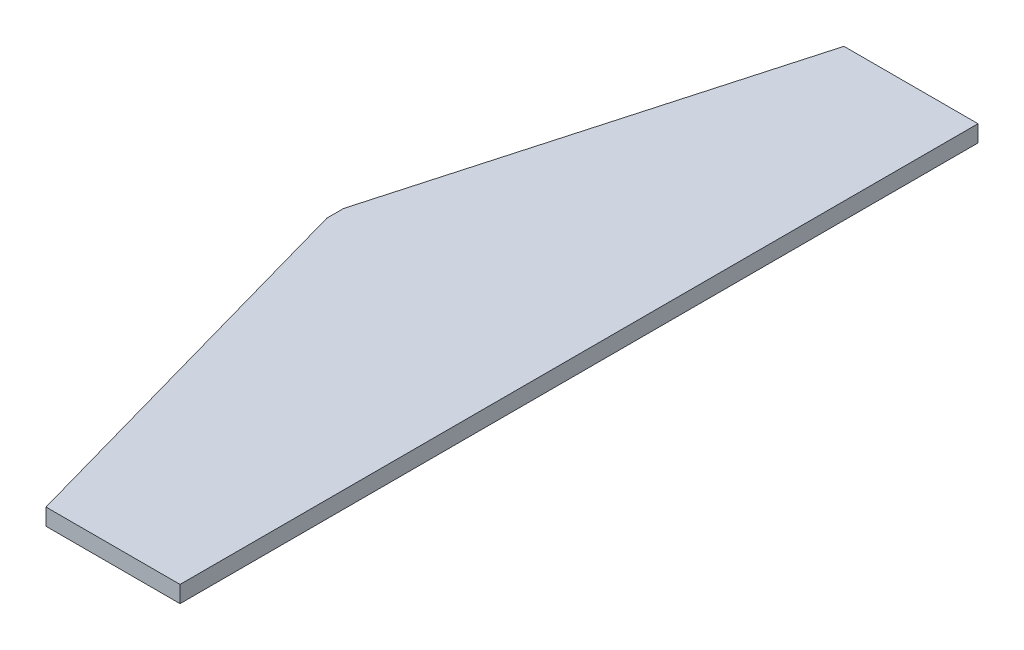
ISO-10303-21;
HEADER;
FILE_DESCRIPTION(('STEP AP214'),'2;1');
FILE_NAME('part.step','',(''),(''),'','','');
FILE_SCHEMA(('AUTOMOTIVE_DESIGN { 1 0 10303 214 1 1 1 1 }'));
ENDSEC;
DATA;
#1=APPLICATION_CONTEXT('core data for automotive mechanical design processes');
#2=APPLICATION_PROTOCOL_DEFINITION('international standard','automotive_design',2000,#1);
#3=PRODUCT_CONTEXT('',#1,'mechanical');
#4=PRODUCT('Part','Part','',(#3));
#5=PRODUCT_RELATED_PRODUCT_CATEGORY('part','',(#4));
#6=PRODUCT_DEFINITION_FORMATION('','',#4);
#7=PRODUCT_DEFINITION_CONTEXT('part definition',#1,'design');
#8=PRODUCT_DEFINITION('design','',#6,#7);
#9=PRODUCT_DEFINITION_SHAPE('','',#8);
#10=(LENGTH_UNIT() NAMED_UNIT(*) SI_UNIT(.MILLI.,.METRE.));
#11=(NAMED_UNIT(*) PLANE_ANGLE_UNIT() SI_UNIT($,.RADIAN.));
#12=(NAMED_UNIT(*) SI_UNIT($,.STERADIAN.) SOLID_ANGLE_UNIT());
#13=UNCERTAINTY_MEASURE_WITH_UNIT(LENGTH_MEASURE(1.E-05),#10,'distance_accuracy_value','');
#14=(GEOMETRIC_REPRESENTATION_CONTEXT(3) GLOBAL_UNCERTAINTY_ASSIGNED_CONTEXT((#13)) GLOBAL_UNIT_ASSIGNED_CONTEXT((#10,
#11,#12)) REPRESENTATION_CONTEXT('',''));
#15=CARTESIAN_POINT('',(0.,0.,0.));
#16=DIRECTION('',(0.,0.,1.));
#17=DIRECTION('',(1.,0.,0.));
#18=AXIS2_PLACEMENT_3D('',#15,#16,#17);
#19=CARTESIAN_POINT('',(52.4661441714905,12.,3.00000000000001));
#20=DIRECTION('',(1.,0.,0.));
#21=DIRECTION('',(0.,0.,-1.));
#22=AXIS2_PLACEMENT_3D('',#19,#20,#21);
#23=PLANE('',#22);
#24=DIRECTION('',(0.,0.,1.));
#25=VECTOR('',#24,1.);
#26=CARTESIAN_POINT('',(52.4661441714905,3.,3.00000000000001));
#27=LINE('',#26,#25);
#28=CARTESIAN_POINT('',(52.4661441714905,3.,3.00000000000001));
#29=VERTEX_POINT('',#28);
#30=CARTESIAN_POINT('',(52.4661441714905,3.,12.));
#31=VERTEX_POINT('',#30);
#32=EDGE_CURVE('E120',#29,#31,#27,.T.);
#33=ORIENTED_EDGE('',*,*,#32,.T.);
#34=DIRECTION('',(0.,-1.,0.));
#35=VECTOR('',#34,1.);
#36=CARTESIAN_POINT('',(52.4661441714905,12.,12.));
#37=LINE('',#36,#35);
#38=CARTESIAN_POINT('',(52.4661441714905,12.,12.));
#39=VERTEX_POINT('',#38);
#40=EDGE_CURVE('E11',#39,#31,#37,.T.);
#41=ORIENTED_EDGE('',*,*,#40,.F.);
#42=DIRECTION('',(0.,0.,1.));
#43=VECTOR('',#42,1.);
#44=CARTESIAN_POINT('',(52.4661441714905,12.,3.00000000000001));
#45=LINE('',#44,#43);
#46=CARTESIAN_POINT('',(52.4661441714905,12.,3.00000000000001));
#47=VERTEX_POINT('',#46);
#48=EDGE_CURVE('E131',#47,#39,#45,.T.);
#49=ORIENTED_EDGE('',*,*,#48,.F.);
#50=DIRECTION('',(0.,-1.,0.));
#51=VECTOR('',#50,1.);
#52=CARTESIAN_POINT('',(52.4661441714905,12.,3.00000000000001));
#53=LINE('',#52,#51);
#54=EDGE_CURVE('E116',#47,#29,#53,.T.);
#55=ORIENTED_EDGE('',*,*,#54,.T.);
#56=EDGE_LOOP('',(#33,#41,#49,#55));
#57=FACE_BOUND('',#56,.T.);
#58=ADVANCED_FACE('F37',(#57),#23,.F.);
#59=CARTESIAN_POINT('',(111.626144171491,12.,222.54));
#60=DIRECTION('',(0.962715715253088,0.,-0.270515159657892));
#61=DIRECTION('',(-0.270515159657892,0.,-0.962715715253088));
#62=AXIS2_PLACEMENT_3D('',#59,#60,#61);
#63=PLANE('',#62);
#64=DIRECTION('',(0.270515159657892,0.,0.962715715253088));
#65=VECTOR('',#64,1.);
#66=CARTESIAN_POINT('',(111.626144171491,3.,222.54));
#67=LINE('',#66,#65);
#68=CARTESIAN_POINT('',(111.626144171491,3.,222.54));
#69=VERTEX_POINT('',#68);
#70=EDGE_CURVE('E123',#31,#69,#67,.T.);
#71=ORIENTED_EDGE('',*,*,#70,.T.);
#72=DIRECTION('',(0.,-1.,0.));
#73=VECTOR('',#72,1.);
#74=CARTESIAN_POINT('',(111.626144171491,12.,222.54));
#75=LINE('',#74,#73);
#76=CARTESIAN_POINT('',(111.626144171491,12.,222.54));
#77=VERTEX_POINT('',#76);
#78=EDGE_CURVE('E45',#77,#69,#75,.T.);
#79=ORIENTED_EDGE('',*,*,#78,.F.);
#80=DIRECTION('',(0.270515159657892,0.,0.962715715253088));
#81=VECTOR('',#80,1.);
#82=CARTESIAN_POINT('',(111.626144171491,12.,222.54));
#83=LINE('',#82,#81);
#84=EDGE_CURVE('E90',#39,#77,#83,.T.);
#85=ORIENTED_EDGE('',*,*,#84,.F.);
#86=ORIENTED_EDGE('',*,*,#40,.T.);
#87=EDGE_LOOP('',(#71,#79,#85,#86));
#88=FACE_BOUND('',#87,.T.);
#89=ADVANCED_FACE('F155',(#88),#63,.F.);
#90=CARTESIAN_POINT('',(183.866144171491,12.,222.54));
#91=DIRECTION('',(0.,0.,-1.));
#92=DIRECTION('',(-1.,0.,0.));
#93=AXIS2_PLACEMENT_3D('',#90,#91,#92);
#94=PLANE('',#93);
#95=DIRECTION('',(1.,0.,0.));
#96=VECTOR('',#95,1.);
#97=CARTESIAN_POINT('',(183.866144171491,3.,222.54));
#98=LINE('',#97,#96);
#99=CARTESIAN_POINT('',(183.866144171491,3.,222.54));
#100=VERTEX_POINT('',#99);
#101=EDGE_CURVE('E125',#69,#100,#98,.T.);
#102=ORIENTED_EDGE('',*,*,#101,.T.);
#103=DIRECTION('',(0.,-1.,0.));
#104=VECTOR('',#103,1.);
#105=CARTESIAN_POINT('',(183.866144171491,12.,222.54));
#106=LINE('',#105,#104);
#107=CARTESIAN_POINT('',(183.866144171491,12.,222.54));
#108=VERTEX_POINT('',#107);
#109=EDGE_CURVE('E111',#108,#100,#106,.T.);
#110=ORIENTED_EDGE('',*,*,#109,.F.);
#111=DIRECTION('',(1.,0.,0.));
#112=VECTOR('',#111,1.);
#113=CARTESIAN_POINT('',(183.866144171491,12.,222.54));
#114=LINE('',#113,#112);
#115=EDGE_CURVE('E103',#77,#108,#114,.T.);
#116=ORIENTED_EDGE('',*,*,#115,.F.);
#117=ORIENTED_EDGE('',*,*,#78,.T.);
#118=EDGE_LOOP('',(#102,#110,#116,#117));
#119=FACE_BOUND('',#118,.T.);
#120=ADVANCED_FACE('F137',(#119),#94,.F.);
#121=CARTESIAN_POINT('',(183.866144171491,12.,3.00000000000001));
#122=DIRECTION('',(-1.,0.,0.));
#123=DIRECTION('',(0.,0.,1.));
#124=AXIS2_PLACEMENT_3D('',#121,#122,#123);
#125=PLANE('',#124);
#126=DIRECTION('',(0.,0.,-1.));
#127=VECTOR('',#126,1.);
#128=CARTESIAN_POINT('',(183.866144171491,3.,3.00000000000001));
#129=LINE('',#128,#127);
#130=CARTESIAN_POINT('',(183.866144171491,3.,-207.54));
#131=VERTEX_POINT('',#130);
#132=EDGE_CURVE('E110',#100,#131,#129,.T.);
#133=ORIENTED_EDGE('',*,*,#132,.T.);
#134=DIRECTION('',(0.,-1.,0.));
#135=VECTOR('',#134,1.);
#136=CARTESIAN_POINT('',(183.866144171491,12.,-207.54));
#137=LINE('',#136,#135);
#138=CARTESIAN_POINT('',(183.866144171491,12.,-207.54));
#139=VERTEX_POINT('',#138);
#140=EDGE_CURVE('E108',#139,#131,#137,.T.);
#141=ORIENTED_EDGE('',*,*,#140,.F.);
#142=DIRECTION('',(0.,0.,-1.));
#143=VECTOR('',#142,1.);
#144=CARTESIAN_POINT('',(183.866144171491,12.,12.));
#145=LINE('',#144,#143);
#146=EDGE_CURVE('E97',#108,#139,#145,.T.);
#147=ORIENTED_EDGE('',*,*,#146,.F.);
#148=ORIENTED_EDGE('',*,*,#109,.T.);
#149=EDGE_LOOP('',(#133,#141,#147,#148));
#150=FACE_BOUND('',#149,.T.);
#151=ADVANCED_FACE('F109',(#150),#125,.F.);
#152=CARTESIAN_POINT('',(183.866144171491,12.,-207.54));
#153=DIRECTION('',(0.,0.,1.));
#154=DIRECTION('',(1.,0.,0.));
#155=AXIS2_PLACEMENT_3D('',#152,#153,#154);
#156=PLANE('',#155);
#157=DIRECTION('',(-1.,0.,0.));
#158=VECTOR('',#157,1.);
#159=CARTESIAN_POINT('',(183.866144171491,3.,-207.54));
#160=LINE('',#159,#158);
#161=CARTESIAN_POINT('',(111.626144171491,3.,-207.54));
#162=VERTEX_POINT('',#161);
#163=EDGE_CURVE('E76',#131,#162,#160,.T.);
#164=ORIENTED_EDGE('',*,*,#163,.T.);
#165=DIRECTION('',(0.,-1.,0.));
#166=VECTOR('',#165,1.);
#167=CARTESIAN_POINT('',(111.626144171491,12.,-207.54));
#168=LINE('',#167,#166);
#169=CARTESIAN_POINT('',(111.626144171491,12.,-207.54));
#170=VERTEX_POINT('',#169);
#171=EDGE_CURVE('E112',#170,#162,#168,.T.);
#172=ORIENTED_EDGE('',*,*,#171,.F.);
#173=DIRECTION('',(-1.,0.,0.));
#174=VECTOR('',#173,1.);
#175=CARTESIAN_POINT('',(183.866144171491,12.,-207.54));
#176=LINE('',#175,#174);
#177=EDGE_CURVE('E101',#139,#170,#176,.T.);
#178=ORIENTED_EDGE('',*,*,#177,.F.);
#179=ORIENTED_EDGE('',*,*,#140,.T.);
#180=EDGE_LOOP('',(#164,#172,#178,#179));
#181=FACE_BOUND('',#180,.T.);
#182=ADVANCED_FACE('F114',(#181),#156,.F.);
#183=CARTESIAN_POINT('',(111.626144171491,12.,-207.54));
#184=DIRECTION('',(0.962715715253088,0.,0.270515159657892));
#185=DIRECTION('',(0.270515159657892,0.,-0.962715715253088));
#186=AXIS2_PLACEMENT_3D('',#183,#184,#185);
#187=PLANE('',#186);
#188=DIRECTION('',(-0.270515159657892,0.,0.962715715253088));
#189=VECTOR('',#188,1.);
#190=CARTESIAN_POINT('',(111.626144171491,3.,-207.54));
#191=LINE('',#190,#189);
#192=EDGE_CURVE('E82',#162,#29,#191,.T.);
#193=ORIENTED_EDGE('',*,*,#192,.T.);
#194=ORIENTED_EDGE('',*,*,#54,.F.);
#195=DIRECTION('',(-0.270515159657892,0.,0.962715715253088));
#196=VECTOR('',#195,1.);
#197=CARTESIAN_POINT('',(111.626144171491,12.,-207.54));
#198=LINE('',#197,#196);
#199=EDGE_CURVE('E53',#170,#47,#198,.T.);
#200=ORIENTED_EDGE('',*,*,#199,.F.);
#201=ORIENTED_EDGE('',*,*,#171,.T.);
#202=EDGE_LOOP('',(#193,#194,#200,#201));
#203=FACE_BOUND('',#202,.T.);
#204=ADVANCED_FACE('F144',(#203),#187,.F.);
#205=CARTESIAN_POINT('',(52.4661441714905,12.,3.00000000000001));
#206=DIRECTION('',(0.,-1.,0.));
#207=DIRECTION('',(0.,0.,-1.));
#208=AXIS2_PLACEMENT_3D('',#205,#206,#207);
#209=PLANE('',#208);
#210=ORIENTED_EDGE('',*,*,#48,.T.);
#211=ORIENTED_EDGE('',*,*,#84,.T.);
#212=ORIENTED_EDGE('',*,*,#115,.T.);
#213=ORIENTED_EDGE('',*,*,#146,.T.);
#214=ORIENTED_EDGE('',*,*,#177,.T.);
#215=ORIENTED_EDGE('',*,*,#199,.T.);
#216=EDGE_LOOP('',(#210,#211,#212,#213,#214,#215));
#217=FACE_BOUND('',#216,.T.);
#218=ADVANCED_FACE('F99',(#217),#209,.F.);
#219=CARTESIAN_POINT('',(52.4661441714905,3.,3.00000000000001));
#220=DIRECTION('',(0.,-1.,0.));
#221=DIRECTION('',(0.,0.,-1.));
#222=AXIS2_PLACEMENT_3D('',#219,#220,#221);
#223=PLANE('',#222);
#224=ORIENTED_EDGE('',*,*,#32,.F.);
#225=ORIENTED_EDGE('',*,*,#192,.F.);
#226=ORIENTED_EDGE('',*,*,#163,.F.);
#227=ORIENTED_EDGE('',*,*,#132,.F.);
#228=ORIENTED_EDGE('',*,*,#101,.F.);
#229=ORIENTED_EDGE('',*,*,#70,.F.);
#230=EDGE_LOOP('',(#224,#225,#226,#227,#228,#229));
#231=FACE_BOUND('',#230,.T.);
#232=ADVANCED_FACE('F140',(#231),#223,.T.);
#233=CLOSED_SHELL('',(#58,#89,#120,#151,#182,#204,#218,#232));
#234=MANIFOLD_SOLID_BREP('B2',#233);
#235=ADVANCED_BREP_SHAPE_REPRESENTATION('',(#18,#234),#14);
#236=SHAPE_DEFINITION_REPRESENTATION(#9,#235);
ENDSEC;
END-ISO-10303-21;
